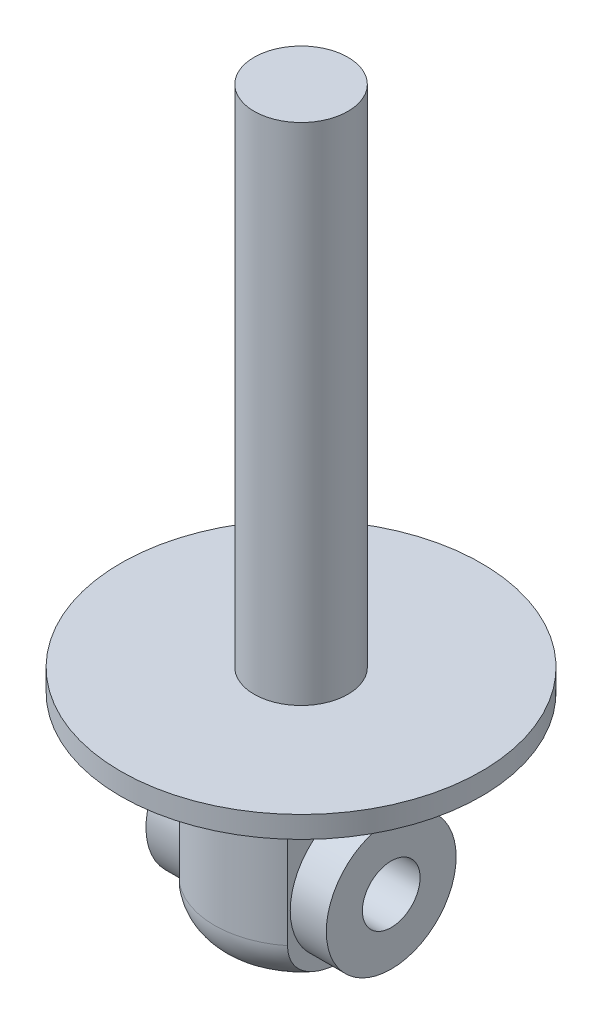
ISO-10303-21;
HEADER;
FILE_DESCRIPTION(('STEP AP214'),'2;1');
FILE_NAME('part.step','',(''),(''),'','','');
FILE_SCHEMA(('AUTOMOTIVE_DESIGN { 1 0 10303 214 1 1 1 1 }'));
ENDSEC;
DATA;
#1=APPLICATION_CONTEXT('core data for automotive mechanical design processes');
#2=APPLICATION_PROTOCOL_DEFINITION('international standard','automotive_design',2000,#1);
#3=PRODUCT_CONTEXT('',#1,'mechanical');
#4=PRODUCT('Part','Part','',(#3));
#5=PRODUCT_RELATED_PRODUCT_CATEGORY('part','',(#4));
#6=PRODUCT_DEFINITION_FORMATION('','',#4);
#7=PRODUCT_DEFINITION_CONTEXT('part definition',#1,'design');
#8=PRODUCT_DEFINITION('design','',#6,#7);
#9=PRODUCT_DEFINITION_SHAPE('','',#8);
#10=(LENGTH_UNIT() NAMED_UNIT(*) SI_UNIT(.MILLI.,.METRE.));
#11=(NAMED_UNIT(*) PLANE_ANGLE_UNIT() SI_UNIT($,.RADIAN.));
#12=(NAMED_UNIT(*) SI_UNIT($,.STERADIAN.) SOLID_ANGLE_UNIT());
#13=UNCERTAINTY_MEASURE_WITH_UNIT(LENGTH_MEASURE(1.E-05),#10,'distance_accuracy_value','');
#14=(GEOMETRIC_REPRESENTATION_CONTEXT(3) GLOBAL_UNCERTAINTY_ASSIGNED_CONTEXT((#13)) GLOBAL_UNIT_ASSIGNED_CONTEXT((#10,
#11,#12)) REPRESENTATION_CONTEXT('',''));
#15=CARTESIAN_POINT('',(0.,0.,0.));
#16=DIRECTION('',(0.,0.,1.));
#17=DIRECTION('',(1.,0.,0.));
#18=AXIS2_PLACEMENT_3D('',#15,#16,#17);
#19=CARTESIAN_POINT('',(7.5,-28.,-25.));
#20=DIRECTION('',(-1.,0.,0.));
#21=DIRECTION('',(0.,0.,1.));
#22=AXIS2_PLACEMENT_3D('',#19,#20,#21);
#23=PLANE('',#22);
#24=CARTESIAN_POINT('',(7.5,-27.8094750193111,0.));
#25=CARTESIAN_POINT('',(7.5,-27.8094752958151,-0.18452162824242));
#26=CARTESIAN_POINT('',(7.5,-27.8077270322999,-0.369043480287192));
#27=CARTESIAN_POINT('',(7.5,-27.8006130628877,-0.737999394292285));
#28=CARTESIAN_POINT('',(7.5,-27.7952477367066,-0.922433463434385));
#29=CARTESIAN_POINT('',(7.5,-27.780538513706,-1.29122559425462));
#30=CARTESIAN_POINT('',(7.5,-27.7711929215574,-1.47558358999919));
#31=CARTESIAN_POINT('',(7.5,-27.7479507640883,-1.84401846668315));
#32=CARTESIAN_POINT('',(7.5,-27.734054140347,-2.02809534398339));
#33=CARTESIAN_POINT('',(7.5,-27.701027325669,-2.39498843631837));
#34=CARTESIAN_POINT('',(7.5,-27.6819201299087,-2.57780665418326));
#35=CARTESIAN_POINT('',(7.5,-27.6375682217561,-2.94269408038084));
#36=CARTESIAN_POINT('',(7.5,-27.6123230495969,-3.12476323156505));
#37=CARTESIAN_POINT('',(7.5,-27.5259360262262,-3.6691632505479));
#38=CARTESIAN_POINT('',(7.5,-27.4541196223952,-4.02997739530099));
#39=CARTESIAN_POINT('',(7.5,-27.315114172541,-4.57935988961709));
#40=CARTESIAN_POINT('',(7.5,-27.2608348848703,-4.77122256452969));
#41=CARTESIAN_POINT('',(7.5,-27.1402411036094,-5.15109529504943));
#42=CARTESIAN_POINT('',(7.5,-27.0739312594077,-5.33910680786539));
#43=CARTESIAN_POINT('',(7.5,-26.9281486989919,-5.70992505463463));
#44=CARTESIAN_POINT('',(7.5,-26.8486797977089,-5.8927332791208));
#45=CARTESIAN_POINT('',(7.5,-26.6756224712841,-6.25155879665883));
#46=CARTESIAN_POINT('',(7.5,-26.5820364486501,-6.42757723883459));
#47=CARTESIAN_POINT('',(7.5,-26.3958384208508,-6.74413785402998));
#48=CARTESIAN_POINT('',(7.5,-26.3053527427416,-6.8859302136676));
#49=CARTESIAN_POINT('',(7.5,-26.1136422044668,-7.16205254122039));
#50=CARTESIAN_POINT('',(7.5,-26.0124194056704,-7.29638393401336));
#51=CARTESIAN_POINT('',(7.5,-25.7991822855038,-7.55627452274061));
#52=CARTESIAN_POINT('',(7.5,-25.6871652583255,-7.6818315054992));
#53=CARTESIAN_POINT('',(7.5,-25.4525813942248,-7.92270374400352));
#54=CARTESIAN_POINT('',(7.5,-25.3300144777409,-8.03801892249803));
#55=CARTESIAN_POINT('',(7.5,-25.0736714823962,-8.25792234562975));
#56=CARTESIAN_POINT('',(7.5,-24.9398051473305,-8.36240569865935));
#57=CARTESIAN_POINT('',(7.5,-24.662616920615,-8.55796576900282));
#58=CARTESIAN_POINT('',(7.5,-24.5192963548439,-8.64904436046083));
#59=CARTESIAN_POINT('',(7.5,-24.2243409104845,-8.81636481076627));
#60=CARTESIAN_POINT('',(7.5,-24.0727112205184,-8.89261579636783));
#61=CARTESIAN_POINT('',(7.5,-23.7624095052739,-9.02909243430965));
#62=CARTESIAN_POINT('',(7.5,-23.6037388369551,-9.08932115899453));
#63=CARTESIAN_POINT('',(7.5,-23.3052245459151,-9.1849514334904));
#64=CARTESIAN_POINT('',(7.5,-23.1661361294911,-9.22272405795733));
#65=CARTESIAN_POINT('',(7.5,-22.8851087613884,-9.28547940350163));
#66=CARTESIAN_POINT('',(7.5,-22.7431701638949,-9.31046370365637));
#67=CARTESIAN_POINT('',(7.5,-22.4576599589478,-9.34730641699015));
#68=CARTESIAN_POINT('',(7.5,-22.3140890586128,-9.35917031033292));
#69=CARTESIAN_POINT('',(7.5,-22.0264648581988,-9.36963164548865));
#70=CARTESIAN_POINT('',(7.5,-21.8824115750842,-9.36822954903947));
#71=CARTESIAN_POINT('',(7.5,-21.6061914815275,-9.35280339576898));
#72=CARTESIAN_POINT('',(7.5,-21.4739684759153,-9.33976569953801));
#73=CARTESIAN_POINT('',(7.5,-21.2110534946456,-9.3025636387872));
#74=CARTESIAN_POINT('',(7.5,-21.0803620180608,-9.27839574533066));
#75=CARTESIAN_POINT('',(7.5,-20.8215410609612,-9.21922065645586));
#76=CARTESIAN_POINT('',(7.5,-20.6934101253726,-9.1842198149556));
#77=CARTESIAN_POINT('',(7.5,-20.4404340442512,-9.1037455253616));
#78=CARTESIAN_POINT('',(7.5,-20.3155901493276,-9.05826815366643));
#79=CARTESIAN_POINT('',(7.5,-20.0692031015505,-8.95699564520569));
#80=CARTESIAN_POINT('',(7.5,-19.9476868658852,-8.90113499399755));
#81=CARTESIAN_POINT('',(7.5,-19.7094920695403,-8.77987692751896));
#82=CARTESIAN_POINT('',(7.5,-19.5928152563103,-8.71447610526943));
#83=CARTESIAN_POINT('',(7.5,-19.2509911073174,-8.50489875856371));
#84=CARTESIAN_POINT('',(7.5,-19.0339195251877,-8.34729299116934));
#85=CARTESIAN_POINT('',(7.5,-18.609337427954,-7.98870608163153));
#86=CARTESIAN_POINT('',(7.5,-18.4039002281567,-7.78529755950601));
#87=CARTESIAN_POINT('',(7.5,-18.0246758733926,-7.35109040646743));
#88=CARTESIAN_POINT('',(7.5,-17.8508837047537,-7.12029612399674));
#89=CARTESIAN_POINT('',(7.5,-17.5744409595824,-6.69864287979115));
#90=CARTESIAN_POINT('',(7.5,-17.4648689537028,-6.51223410047273));
#91=CARTESIAN_POINT('',(7.5,-17.2626904112623,-6.13034538679086));
#92=CARTESIAN_POINT('',(7.5,-17.1700919878543,-5.93486117014358));
#93=CARTESIAN_POINT('',(7.5,-17.0006313082269,-5.53658641063457));
#94=CARTESIAN_POINT('',(7.5,-16.9238147555949,-5.3337765932138));
#95=CARTESIAN_POINT('',(7.5,-16.784875362625,-4.9233142846081));
#96=CARTESIAN_POINT('',(7.5,-16.7227484430634,-4.71566315546474));
#97=CARTESIAN_POINT('',(7.5,-16.5386673542946,-4.02250667384635));
#98=CARTESIAN_POINT('',(7.5,-16.4449803111871,-3.52942656369882));
#99=CARTESIAN_POINT('',(7.5,-16.3412352530644,-2.78498720051467));
#100=CARTESIAN_POINT('',(7.5,-16.3127705467372,-2.5356855777005));
#101=CARTESIAN_POINT('',(7.5,-16.2658269581612,-2.03612434937439));
#102=CARTESIAN_POINT('',(7.5,-16.2473468655649,-1.78586486368142));
#103=CARTESIAN_POINT('',(7.5,-16.2184283009414,-1.28363112408653));
#104=CARTESIAN_POINT('',(7.5,-16.208031590786,-1.03165466176092));
#105=CARTESIAN_POINT('',(7.5,-16.1941849220444,-0.527501194688685));
#106=CARTESIAN_POINT('',(7.5,-16.1907352988047,-0.275324180848917));
#107=CARTESIAN_POINT('',(7.5,-16.1903333462322,0.228731345602969));
#108=CARTESIAN_POINT('',(7.5,-16.193373232494,0.480609853630167));
#109=CARTESIAN_POINT('',(7.5,-16.2063332691715,0.984173581494259));
#110=CARTESIAN_POINT('',(7.5,-16.2162528039696,1.23585881660873));
#111=CARTESIAN_POINT('',(7.5,-16.2454935008677,1.76278825668933));
#112=CARTESIAN_POINT('',(7.5,-16.2656211327378,2.03798990109171));
#113=CARTESIAN_POINT('',(7.5,-16.3180418431017,2.58731345976838));
#114=CARTESIAN_POINT('',(7.5,-16.3503365349836,2.86143522597443));
#115=CARTESIAN_POINT('',(7.5,-16.4300545548583,3.40623279358436));
#116=CARTESIAN_POINT('',(7.5,-16.4774071358833,3.67691867401873));
#117=CARTESIAN_POINT('',(7.5,-16.5907053400646,4.21439476079951));
#118=CARTESIAN_POINT('',(7.5,-16.6566449229111,4.4811862031647));
#119=CARTESIAN_POINT('',(7.5,-16.7911834026755,4.94217748017442));
#120=CARTESIAN_POINT('',(7.5,-16.8549558474619,5.13778160857807));
#121=CARTESIAN_POINT('',(7.5,-16.9961265709521,5.5239942274174));
#122=CARTESIAN_POINT('',(7.5,-17.0735207892669,5.71460418712136));
#123=CARTESIAN_POINT('',(7.5,-17.2430793617625,6.08921987221889));
#124=CARTESIAN_POINT('',(7.5,-17.3352463319138,6.27322442084438));
#125=CARTESIAN_POINT('',(7.5,-17.5351759469553,6.63256976145457));
#126=CARTESIAN_POINT('',(7.5,-17.6429345063483,6.80791280693597));
#127=CARTESIAN_POINT('',(7.5,-17.8487615005736,7.10989658300674));
#128=CARTESIAN_POINT('',(7.5,-17.9436617626469,7.23870103997639));
#129=CARTESIAN_POINT('',(7.5,-18.143229826346,7.48856622066219));
#130=CARTESIAN_POINT('',(7.5,-18.2478987883735,7.60962602152205));
#131=CARTESIAN_POINT('',(7.5,-18.4668045949393,7.84271387792474));
#132=CARTESIAN_POINT('',(7.5,-18.5810384459287,7.95474473789612));
#133=CARTESIAN_POINT('',(7.5,-18.8187268203134,8.16854933672494));
#134=CARTESIAN_POINT('',(7.5,-18.9421800591116,8.27032449994957));
#135=CARTESIAN_POINT('',(7.5,-19.1987356397018,8.46313596223061));
#136=CARTESIAN_POINT('',(7.5,-19.3319055781875,8.55408255407202));
#137=CARTESIAN_POINT('',(7.5,-19.6061418402457,8.72304401015934));
#138=CARTESIAN_POINT('',(7.5,-19.747204378254,8.80106500403696));
#139=CARTESIAN_POINT('',(7.5,-20.0362068877473,8.94309470867639));
#140=CARTESIAN_POINT('',(7.5,-20.1841460034049,9.00710515749598));
#141=CARTESIAN_POINT('',(7.5,-20.4856380297523,9.12014361193693));
#142=CARTESIAN_POINT('',(7.5,-20.6391901444676,9.16917373274798));
#143=CARTESIAN_POINT('',(7.5,-20.9313639562727,9.24643392787081));
#144=CARTESIAN_POINT('',(7.5,-21.0695088202567,9.27647685632879));
#145=CARTESIAN_POINT('',(7.5,-21.3479315795213,9.32406143536891));
#146=CARTESIAN_POINT('',(7.5,-21.4882092809526,9.34160421520928));
#147=CARTESIAN_POINT('',(7.5,-21.769719609589,9.36396002322678));
#148=CARTESIAN_POINT('',(7.5,-21.9109518422674,9.36877802253041));
#149=CARTESIAN_POINT('',(7.5,-22.1932734390957,9.36563613906261));
#150=CARTESIAN_POINT('',(7.5,-22.3343628067459,9.35767657732182));
#151=CARTESIAN_POINT('',(7.5,-22.6064011749062,9.32998563551062));
#152=CARTESIAN_POINT('',(7.5,-22.7374295539783,9.31102660205278));
#153=CARTESIAN_POINT('',(7.5,-22.9974780227225,9.26218788836622));
#154=CARTESIAN_POINT('',(7.5,-23.1264974548056,9.23230470755187));
#155=CARTESIAN_POINT('',(7.5,-23.3815508516767,9.16196479385525));
#156=CARTESIAN_POINT('',(7.5,-23.5075862018083,9.12151307666088));
#157=CARTESIAN_POINT('',(7.5,-23.7559772755244,9.03044888037393));
#158=CARTESIAN_POINT('',(7.5,-23.8783315975104,8.97983258590814));
#159=CARTESIAN_POINT('',(7.5,-24.1205569584555,8.8680617574251));
#160=CARTESIAN_POINT('',(7.5,-24.2403549182387,8.80674877020291));
#161=CARTESIAN_POINT('',(7.5,-24.4747211723639,8.67480187441993));
#162=CARTESIAN_POINT('',(7.5,-24.5892875713423,8.60416462323317));
#163=CARTESIAN_POINT('',(7.5,-24.9242270275788,8.37928997825773));
#164=CARTESIAN_POINT('',(7.5,-25.13600210755,8.21201407264852));
#165=CARTESIAN_POINT('',(7.5,-25.5504485361803,7.832942739178));
#166=CARTESIAN_POINT('',(7.5,-25.7507010772538,7.618532285847));
#167=CARTESIAN_POINT('',(7.5,-26.1185076671662,7.16337882817298));
#168=CARTESIAN_POINT('',(7.5,-26.2860513710234,6.9226275303298));
#169=CARTESIAN_POINT('',(7.5,-26.5545024709803,6.4788664395953));
#170=CARTESIAN_POINT('',(7.5,-26.6619013252763,6.279707295078));
#171=CARTESIAN_POINT('',(7.5,-26.858559219587,5.87254463104013));
#172=CARTESIAN_POINT('',(7.5,-26.9478095430477,5.66453691936401));
#173=CARTESIAN_POINT('',(7.5,-27.1096214973705,5.24180758530232));
#174=CARTESIAN_POINT('',(7.5,-27.1821555960046,5.02707553901331));
#175=CARTESIAN_POINT('',(7.5,-27.3121001369762,4.59305326757355));
#176=CARTESIAN_POINT('',(7.5,-27.3695048137837,4.37376133898656));
#177=CARTESIAN_POINT('',(7.5,-27.4981886749365,3.81417726059937));
#178=CARTESIAN_POINT('',(7.5,-27.5604951716191,3.47183296905169));
#179=CARTESIAN_POINT('',(7.5,-27.6609019684328,2.78359200614869));
#180=CARTESIAN_POINT('',(7.5,-27.6989863972919,2.43769315620305));
#181=CARTESIAN_POINT('',(7.5,-27.7425563308733,1.91723181279188));
#182=CARTESIAN_POINT('',(7.5,-27.7548291128016,1.74318957751326));
#183=CARTESIAN_POINT('',(7.5,-27.7753986995787,1.39487161182967));
#184=CARTESIAN_POINT('',(7.5,-27.7836956019396,1.22059588725638));
#185=CARTESIAN_POINT('',(7.5,-27.796777523185,0.871965392986039));
#186=CARTESIAN_POINT('',(7.5,-27.8015635129394,0.69761065849217));
#187=CARTESIAN_POINT('',(7.5,-27.8079121855994,0.348837350643893));
#188=CARTESIAN_POINT('',(7.5,-27.8094747579462,0.174418775305038));
#189=CARTESIAN_POINT('',(7.5,-27.8094750193111,0.));
#190=B_SPLINE_CURVE_WITH_KNOTS('',3,(#24,#25,#26,#27,#28,#29,#30,#31,#32,#33,#34,#35,#36,#37,
#38,#39,#40,#41,#42,#43,#44,#45,#46,#47,#48,#49,#50,#51,#52,#53,#54,#55,#56,#57,#58,#59,#60,#61,
#62,#63,#64,#65,#66,#67,#68,#69,#70,#71,#72,#73,#74,#75,#76,#77,#78,#79,#80,#81,#82,#83,#84,#85,
#86,#87,#88,#89,#90,#91,#92,#93,#94,#95,#96,#97,#98,#99,#100,#101,#102,#103,#104,#105,#106,#107,
#108,#109,#110,#111,#112,#113,#114,#115,#116,#117,#118,#119,#120,#121,#122,#123,#124,#125,#126,
#127,#128,#129,#130,#131,#132,#133,#134,#135,#136,#137,#138,#139,#140,#141,#142,#143,#144,#145,
#146,#147,#148,#149,#150,#151,#152,#153,#154,#155,#156,#157,#158,#159,#160,#161,#162,#163,#164,
#165,#166,#167,#168,#169,#170,#171,#172,#173,#174,#175,#176,#177,#178,#179,#180,#181,#182,#183,
#184,#185,#186,#187,#188,#189),.UNSPECIFIED.,.T.,.F.,(4,2,2,2,2,2,2,2,2,2,2,2,2,2,2,2,2,2,2,2,2,
2,2,2,2,2,2,2,2,2,2,2,2,2,2,2,2,2,2,2,2,2,2,2,2,2,2,2,2,2,2,2,2,2,2,2,2,2,2,2,2,2,2,2,2,2,2,2,2,
2,2,2,2,2,2,2,2,2,2,2,2,2,4),(0.,0.553556541747909,1.10705498067111,1.66078940935171,
2.21453094651203,2.7658672034967,3.31724477121585,4.41912680182767,5.01698525599297,
5.61461314908642,6.21206808675634,6.80942146164093,7.31357153503217,7.81762499361292,
8.32180513447662,8.82598907791493,9.33467160980088,9.84328295415676,10.3515802378956,
10.8597799828438,11.291588037567,11.7233427606026,12.1549170790764,12.5864763761707,
12.9845986570771,13.3828472534997,13.7808627038906,14.1790274594522,14.579795450788,
14.9807069160888,15.7821103743006,16.6461503316802,17.5100532757815,18.1578732554314,
18.8060020817716,19.4559821948789,20.1057815998326,21.6069748462105,22.3596793389022,
23.1122925673176,23.8687687149109,24.6252813779039,25.3808870860739,26.1364251884592,
26.9640249034878,27.7917343993232,28.6156111127982,29.4392203950451,30.0559954213971,
30.6725869093732,31.2892877047367,31.9058271963482,32.3853559200308,32.8649416785199,
33.3443778968313,33.823747436381,34.3068464150843,34.7897156366603,35.2725249226045,
35.7552660053908,36.1788379642464,36.6023716529342,37.0257398573389,37.4490974249689,
37.8458122806135,38.2426543730445,38.6393084704929,39.0361117351622,39.4393886143668,
39.8428104576491,40.6491243408277,41.5260051520067,42.403162850804,43.0810551134699,
43.7592721958252,44.4385984678267,45.1181832448308,46.1608437011148,47.2041866484774,
47.7275747628343,48.2509500399341,48.7741805338585,49.2974289735857),.UNSPECIFIED.);
#191=CARTESIAN_POINT('',(7.5,-22.,9.3674969975976));
#192=VERTEX_POINT('',#191);
#193=CARTESIAN_POINT('',(7.5,-21.9999999999999,-9.36749699759766));
#194=VERTEX_POINT('',#193);
#195=EDGE_CURVE('E151',#192,#194,#190,.T.);
#196=ORIENTED_EDGE('',*,*,#195,.T.);
#197=DIRECTION('',(0.,1.,0.));
#198=VECTOR('',#197,1.);
#199=CARTESIAN_POINT('',(7.5,-28.,-9.3674969975976));
#200=LINE('',#199,#198);
#201=CARTESIAN_POINT('',(7.5,-8.,-9.3674969975976));
#202=VERTEX_POINT('',#201);
#203=EDGE_CURVE('E116',#202,#194,#200,.F.);
#204=ORIENTED_EDGE('',*,*,#203,.F.);
#205=DIRECTION('',(0.,0.,1.));
#206=VECTOR('',#205,1.);
#207=CARTESIAN_POINT('',(7.5,-8.,-25.));
#208=LINE('',#207,#206);
#209=CARTESIAN_POINT('',(7.5,-8.,9.3674969975976));
#210=VERTEX_POINT('',#209);
#211=EDGE_CURVE('E110',#202,#210,#208,.T.);
#212=ORIENTED_EDGE('',*,*,#211,.T.);
#213=DIRECTION('',(0.,1.,0.));
#214=VECTOR('',#213,1.);
#215=CARTESIAN_POINT('',(7.5,-28.,9.3674969975976));
#216=LINE('',#215,#214);
#217=EDGE_CURVE('E122',#192,#210,#216,.T.);
#218=ORIENTED_EDGE('',*,*,#217,.F.);
#219=EDGE_LOOP('',(#196,#204,#212,#218));
#220=FACE_BOUND('',#219,.T.);
#221=CARTESIAN_POINT('',(7.5,-18.,0.));
#222=DIRECTION('',(-1.,0.,0.));
#223=DIRECTION('',(0.,0.,1.));
#224=AXIS2_PLACEMENT_3D('',#221,#222,#223);
#225=CIRCLE('',#224,9.);
#226=CARTESIAN_POINT('',(7.5,-18.,8.99999999999999));
#227=VERTEX_POINT('',#226);
#228=EDGE_CURVE('E11',#227,#227,#225,.F.);
#229=ORIENTED_EDGE('',*,*,#228,.F.);
#230=EDGE_LOOP('',(#229));
#231=FACE_BOUND('',#230,.T.);
#232=ADVANCED_FACE('F45',(#220,#231),#23,.F.);
#233=CARTESIAN_POINT('',(-7.49999999999999,-28.,-25.));
#234=DIRECTION('',(1.,0.,0.));
#235=DIRECTION('',(0.,1.,0.));
#236=AXIS2_PLACEMENT_3D('',#233,#234,#235);
#237=PLANE('',#236);
#238=CARTESIAN_POINT('',(-7.49999999999999,-27.8094750193111,0.));
#239=CARTESIAN_POINT('',(-7.49999999999999,-27.8094752958151,0.184521628242419));
#240=CARTESIAN_POINT('',(-7.49999999999999,-27.8077270322999,0.369043480287191));
#241=CARTESIAN_POINT('',(-7.49999999999999,-27.8006130628877,0.737999394292284));
#242=CARTESIAN_POINT('',(-7.49999999999999,-27.7952477367066,0.922433463434384));
#243=CARTESIAN_POINT('',(-7.49999999999999,-27.780538513706,1.29122559425462));
#244=CARTESIAN_POINT('',(-7.49999999999999,-27.7711929215574,1.47558358999919));
#245=CARTESIAN_POINT('',(-7.49999999999999,-27.7479507640883,1.84401846668315));
#246=CARTESIAN_POINT('',(-7.49999999999999,-27.734054140347,2.02809534398339));
#247=CARTESIAN_POINT('',(-7.49999999999999,-27.701027325669,2.39498843631837));
#248=CARTESIAN_POINT('',(-7.49999999999999,-27.6819201299087,2.57780665418326));
#249=CARTESIAN_POINT('',(-7.49999999999999,-27.6375682217561,2.94269408038083));
#250=CARTESIAN_POINT('',(-7.49999999999999,-27.6123230495969,3.12476323156505));
#251=CARTESIAN_POINT('',(-7.49999999999999,-27.5259360262262,3.6691632505479));
#252=CARTESIAN_POINT('',(-7.49999999999999,-27.4541196223952,4.02997739530099));
#253=CARTESIAN_POINT('',(-7.49999999999999,-27.315114172541,4.57935988961709));
#254=CARTESIAN_POINT('',(-7.49999999999999,-27.2608348848703,4.77122256452969));
#255=CARTESIAN_POINT('',(-7.49999999999999,-27.1402411036094,5.15109529504943));
#256=CARTESIAN_POINT('',(-7.49999999999999,-27.0739312594077,5.33910680786539));
#257=CARTESIAN_POINT('',(-7.49999999999999,-26.928148698992,5.70992505463463));
#258=CARTESIAN_POINT('',(-7.49999999999999,-26.8486797977089,5.8927332791208));
#259=CARTESIAN_POINT('',(-7.49999999999999,-26.6756224712841,6.25155879665883));
#260=CARTESIAN_POINT('',(-7.49999999999999,-26.5820364486502,6.42757723883459));
#261=CARTESIAN_POINT('',(-7.49999999999999,-26.3958384208508,6.74413785402998));
#262=CARTESIAN_POINT('',(-7.49999999999999,-26.3053527427416,6.8859302136676));
#263=CARTESIAN_POINT('',(-7.49999999999999,-26.1136422044668,7.16205254122039));
#264=CARTESIAN_POINT('',(-7.49999999999999,-26.0124194056704,7.29638393401336));
#265=CARTESIAN_POINT('',(-7.49999999999999,-25.7991822855038,7.55627452274061));
#266=CARTESIAN_POINT('',(-7.49999999999999,-25.6871652583255,7.6818315054992));
#267=CARTESIAN_POINT('',(-7.49999999999999,-25.4525813942248,7.92270374400352));
#268=CARTESIAN_POINT('',(-7.49999999999999,-25.3300144777409,8.03801892249803));
#269=CARTESIAN_POINT('',(-7.49999999999999,-25.0736714823962,8.25792234562976));
#270=CARTESIAN_POINT('',(-7.49999999999999,-24.9398051473305,8.36240569865935));
#271=CARTESIAN_POINT('',(-7.49999999999999,-24.662616920615,8.55796576900282));
#272=CARTESIAN_POINT('',(-7.49999999999999,-24.5192963548439,8.64904436046083));
#273=CARTESIAN_POINT('',(-7.49999999999999,-24.2243409104845,8.81636481076627));
#274=CARTESIAN_POINT('',(-7.49999999999999,-24.0727112205184,8.89261579636784));
#275=CARTESIAN_POINT('',(-7.49999999999999,-23.7624095052739,9.02909243430965));
#276=CARTESIAN_POINT('',(-7.49999999999999,-23.6037388369551,9.08932115899454));
#277=CARTESIAN_POINT('',(-7.49999999999999,-23.3052245459151,9.1849514334904));
#278=CARTESIAN_POINT('',(-7.49999999999999,-23.1661361294911,9.22272405795734));
#279=CARTESIAN_POINT('',(-7.49999999999999,-22.8851087613884,9.28547940350164));
#280=CARTESIAN_POINT('',(-7.49999999999999,-22.7431701638949,9.31046370365637));
#281=CARTESIAN_POINT('',(-7.49999999999999,-22.4576599589478,9.34730641699016));
#282=CARTESIAN_POINT('',(-7.49999999999999,-22.3140890586128,9.35917031033292));
#283=CARTESIAN_POINT('',(-7.49999999999999,-22.0264648581988,9.36963164548866));
#284=CARTESIAN_POINT('',(-7.49999999999999,-21.8824115750842,9.36822954903948));
#285=CARTESIAN_POINT('',(-7.49999999999999,-21.6061914815275,9.35280339576899));
#286=CARTESIAN_POINT('',(-7.49999999999999,-21.4739684759153,9.33976569953801));
#287=CARTESIAN_POINT('',(-7.49999999999999,-21.2110534946456,9.30256363878721));
#288=CARTESIAN_POINT('',(-7.49999999999999,-21.0803620180608,9.27839574533066));
#289=CARTESIAN_POINT('',(-7.49999999999999,-20.8215410609612,9.21922065645586));
#290=CARTESIAN_POINT('',(-7.49999999999999,-20.6934101253726,9.18421981495561));
#291=CARTESIAN_POINT('',(-7.49999999999999,-20.4404340442512,9.10374552536161));
#292=CARTESIAN_POINT('',(-7.49999999999999,-20.3155901493276,9.05826815366643));
#293=CARTESIAN_POINT('',(-7.49999999999999,-20.0692031015505,8.95699564520569));
#294=CARTESIAN_POINT('',(-7.49999999999999,-19.9476868658852,8.90113499399756));
#295=CARTESIAN_POINT('',(-7.49999999999999,-19.7094920695403,8.77987692751897));
#296=CARTESIAN_POINT('',(-7.5,-19.5928152563103,8.71447610526943));
#297=CARTESIAN_POINT('',(-7.5,-19.2509911073174,8.50489875856372));
#298=CARTESIAN_POINT('',(-7.5,-19.0339195251877,8.34729299116934));
#299=CARTESIAN_POINT('',(-7.5,-18.609337427954,7.98870608163153));
#300=CARTESIAN_POINT('',(-7.5,-18.4039002281567,7.78529755950601));
#301=CARTESIAN_POINT('',(-7.5,-18.0246758733926,7.35109040646743));
#302=CARTESIAN_POINT('',(-7.5,-17.8508837047537,7.12029612399675));
#303=CARTESIAN_POINT('',(-7.5,-17.5744409595824,6.69864287979116));
#304=CARTESIAN_POINT('',(-7.5,-17.4648689537028,6.51223410047273));
#305=CARTESIAN_POINT('',(-7.5,-17.2626904112623,6.13034538679086));
#306=CARTESIAN_POINT('',(-7.5,-17.1700919878543,5.93486117014358));
#307=CARTESIAN_POINT('',(-7.5,-17.0006313082269,5.53658641063457));
#308=CARTESIAN_POINT('',(-7.5,-16.9238147555949,5.3337765932138));
#309=CARTESIAN_POINT('',(-7.5,-16.784875362625,4.9233142846081));
#310=CARTESIAN_POINT('',(-7.5,-16.7227484430634,4.71566315546474));
#311=CARTESIAN_POINT('',(-7.5,-16.5386673542946,4.02250667384635));
#312=CARTESIAN_POINT('',(-7.49999999999999,-16.4449803111871,3.52942656369881));
#313=CARTESIAN_POINT('',(-7.5,-16.3412352530644,2.78498720051466));
#314=CARTESIAN_POINT('',(-7.5,-16.3127705467372,2.53568557770049));
#315=CARTESIAN_POINT('',(-7.5,-16.2658269581612,2.03612434937438));
#316=CARTESIAN_POINT('',(-7.5,-16.2473468655648,1.78586486368142));
#317=CARTESIAN_POINT('',(-7.5,-16.2184283009414,1.28363112408652));
#318=CARTESIAN_POINT('',(-7.5,-16.208031590786,1.03165466176091));
#319=CARTESIAN_POINT('',(-7.5,-16.1941849220443,0.527501194688679));
#320=CARTESIAN_POINT('',(-7.5,-16.1907352988047,0.275324180848911));
#321=CARTESIAN_POINT('',(-7.5,-16.1903333462322,-0.228731345602977));
#322=CARTESIAN_POINT('',(-7.5,-16.193373232494,-0.480609853630177));
#323=CARTESIAN_POINT('',(-7.5,-16.2063332691715,-0.984173581494269));
#324=CARTESIAN_POINT('',(-7.5,-16.2162528039696,-1.23585881660874));
#325=CARTESIAN_POINT('',(-7.5,-16.2454935008677,-1.76278825668934));
#326=CARTESIAN_POINT('',(-7.5,-16.2656211327378,-2.03798990109171));
#327=CARTESIAN_POINT('',(-7.5,-16.3180418431017,-2.58731345976839));
#328=CARTESIAN_POINT('',(-7.5,-16.3503365349836,-2.86143522597444));
#329=CARTESIAN_POINT('',(-7.5,-16.4300545548583,-3.40623279358437));
#330=CARTESIAN_POINT('',(-7.5,-16.4774071358833,-3.67691867401873));
#331=CARTESIAN_POINT('',(-7.5,-16.5907053400646,-4.21439476079951));
#332=CARTESIAN_POINT('',(-7.5,-16.6566449229111,-4.4811862031647));
#333=CARTESIAN_POINT('',(-7.5,-16.7911834026755,-4.94217748017443));
#334=CARTESIAN_POINT('',(-7.5,-16.8549558474619,-5.13778160857807));
#335=CARTESIAN_POINT('',(-7.5,-16.9961265709521,-5.5239942274174));
#336=CARTESIAN_POINT('',(-7.5,-17.0735207892669,-5.71460418712136));
#337=CARTESIAN_POINT('',(-7.5,-17.2430793617625,-6.08921987221889));
#338=CARTESIAN_POINT('',(-7.5,-17.3352463319138,-6.27322442084438));
#339=CARTESIAN_POINT('',(-7.5,-17.5351759469553,-6.63256976145457));
#340=CARTESIAN_POINT('',(-7.5,-17.6429345063483,-6.80791280693598));
#341=CARTESIAN_POINT('',(-7.5,-17.8487615005736,-7.10989658300674));
#342=CARTESIAN_POINT('',(-7.5,-17.9436617626469,-7.23870103997639));
#343=CARTESIAN_POINT('',(-7.5,-18.143229826346,-7.48856622066219));
#344=CARTESIAN_POINT('',(-7.5,-18.2478987883735,-7.60962602152205));
#345=CARTESIAN_POINT('',(-7.5,-18.4668045949393,-7.84271387792475));
#346=CARTESIAN_POINT('',(-7.5,-18.5810384459287,-7.95474473789612));
#347=CARTESIAN_POINT('',(-7.5,-18.8187268203134,-8.16854933672495));
#348=CARTESIAN_POINT('',(-7.5,-18.9421800591116,-8.27032449994957));
#349=CARTESIAN_POINT('',(-7.5,-19.1987356397018,-8.46313596223061));
#350=CARTESIAN_POINT('',(-7.5,-19.3319055781875,-8.55408255407203));
#351=CARTESIAN_POINT('',(-7.5,-19.6061418402457,-8.72304401015934));
#352=CARTESIAN_POINT('',(-7.49999999999999,-19.747204378254,-8.80106500403696));
#353=CARTESIAN_POINT('',(-7.49999999999999,-20.0362068877473,-8.94309470867639));
#354=CARTESIAN_POINT('',(-7.49999999999999,-20.1841460034049,-9.00710515749598));
#355=CARTESIAN_POINT('',(-7.49999999999999,-20.4856380297523,-9.12014361193693));
#356=CARTESIAN_POINT('',(-7.49999999999999,-20.6391901444676,-9.16917373274798));
#357=CARTESIAN_POINT('',(-7.49999999999999,-20.9313639562727,-9.24643392787081));
#358=CARTESIAN_POINT('',(-7.49999999999999,-21.0695088202567,-9.2764768563288));
#359=CARTESIAN_POINT('',(-7.49999999999999,-21.3479315795213,-9.32406143536892));
#360=CARTESIAN_POINT('',(-7.49999999999999,-21.4882092809527,-9.34160421520928));
#361=CARTESIAN_POINT('',(-7.49999999999999,-21.769719609589,-9.36396002322679));
#362=CARTESIAN_POINT('',(-7.49999999999999,-21.9109518422674,-9.36877802253041));
#363=CARTESIAN_POINT('',(-7.49999999999999,-22.1932734390957,-9.36563613906261));
#364=CARTESIAN_POINT('',(-7.49999999999999,-22.3343628067459,-9.35767657732182));
#365=CARTESIAN_POINT('',(-7.49999999999999,-22.6064011749062,-9.32998563551063));
#366=CARTESIAN_POINT('',(-7.49999999999999,-22.7374295539783,-9.31102660205279));
#367=CARTESIAN_POINT('',(-7.49999999999999,-22.9974780227225,-9.26218788836622));
#368=CARTESIAN_POINT('',(-7.49999999999999,-23.1264974548056,-9.23230470755187));
#369=CARTESIAN_POINT('',(-7.49999999999999,-23.3815508516768,-9.16196479385525));
#370=CARTESIAN_POINT('',(-7.49999999999999,-23.5075862018083,-9.12151307666089));
#371=CARTESIAN_POINT('',(-7.49999999999999,-23.7559772755244,-9.03044888037394));
#372=CARTESIAN_POINT('',(-7.49999999999999,-23.8783315975104,-8.97983258590814));
#373=CARTESIAN_POINT('',(-7.49999999999999,-24.1205569584555,-8.8680617574251));
#374=CARTESIAN_POINT('',(-7.49999999999999,-24.2403549182387,-8.80674877020291));
#375=CARTESIAN_POINT('',(-7.49999999999999,-24.4747211723639,-8.67480187441993));
#376=CARTESIAN_POINT('',(-7.49999999999999,-24.5892875713423,-8.60416462323317));
#377=CARTESIAN_POINT('',(-7.49999999999999,-24.9242270275788,-8.37928997825774));
#378=CARTESIAN_POINT('',(-7.49999999999999,-25.13600210755,-8.21201407264852));
#379=CARTESIAN_POINT('',(-7.49999999999999,-25.5504485361803,-7.832942739178));
#380=CARTESIAN_POINT('',(-7.49999999999999,-25.7507010772538,-7.618532285847));
#381=CARTESIAN_POINT('',(-7.49999999999999,-26.1185076671662,-7.16337882817299));
#382=CARTESIAN_POINT('',(-7.49999999999999,-26.2860513710234,-6.9226275303298));
#383=CARTESIAN_POINT('',(-7.49999999999999,-26.5545024709803,-6.4788664395953));
#384=CARTESIAN_POINT('',(-7.49999999999999,-26.6619013252763,-6.279707295078));
#385=CARTESIAN_POINT('',(-7.49999999999999,-26.858559219587,-5.87254463104013));
#386=CARTESIAN_POINT('',(-7.49999999999999,-26.9478095430477,-5.66453691936402));
#387=CARTESIAN_POINT('',(-7.49999999999999,-27.1096214973705,-5.24180758530233));
#388=CARTESIAN_POINT('',(-7.49999999999999,-27.1821555960046,-5.02707553901332));
#389=CARTESIAN_POINT('',(-7.49999999999999,-27.3121001369762,-4.59305326757357));
#390=CARTESIAN_POINT('',(-7.49999999999999,-27.3695048137837,-4.37376133898657));
#391=CARTESIAN_POINT('',(-7.49999999999999,-27.4981886749365,-3.81417726059937));
#392=CARTESIAN_POINT('',(-7.49999999999999,-27.5604951716191,-3.4718329690517));
#393=CARTESIAN_POINT('',(-7.49999999999999,-27.6609019684328,-2.78359200614869));
#394=CARTESIAN_POINT('',(-7.49999999999999,-27.6989863972919,-2.43769315620305));
#395=CARTESIAN_POINT('',(-7.49999999999999,-27.7425563308733,-1.91723181279188));
#396=CARTESIAN_POINT('',(-7.49999999999999,-27.7548291128016,-1.74318957751326));
#397=CARTESIAN_POINT('',(-7.49999999999999,-27.7753986995787,-1.39487161182967));
#398=CARTESIAN_POINT('',(-7.49999999999999,-27.7836956019396,-1.22059588725638));
#399=CARTESIAN_POINT('',(-7.49999999999999,-27.796777523185,-0.87196539298604));
#400=CARTESIAN_POINT('',(-7.49999999999999,-27.8015635129394,-0.697610658492171));
#401=CARTESIAN_POINT('',(-7.49999999999999,-27.8079121855994,-0.348837350643893));
#402=CARTESIAN_POINT('',(-7.49999999999999,-27.8094747579462,-0.174418775305038));
#403=CARTESIAN_POINT('',(-7.49999999999999,-27.8094750193111,0.));
#404=B_SPLINE_CURVE_WITH_KNOTS('',3,(#238,#239,#240,#241,#242,#243,#244,#245,#246,#247,#248,
#249,#250,#251,#252,#253,#254,#255,#256,#257,#258,#259,#260,#261,#262,#263,#264,#265,#266,#267,
#268,#269,#270,#271,#272,#273,#274,#275,#276,#277,#278,#279,#280,#281,#282,#283,#284,#285,#286,
#287,#288,#289,#290,#291,#292,#293,#294,#295,#296,#297,#298,#299,#300,#301,#302,#303,#304,#305,
#306,#307,#308,#309,#310,#311,#312,#313,#314,#315,#316,#317,#318,#319,#320,#321,#322,#323,#324,
#325,#326,#327,#328,#329,#330,#331,#332,#333,#334,#335,#336,#337,#338,#339,#340,#341,#342,#343,
#344,#345,#346,#347,#348,#349,#350,#351,#352,#353,#354,#355,#356,#357,#358,#359,#360,#361,#362,
#363,#364,#365,#366,#367,#368,#369,#370,#371,#372,#373,#374,#375,#376,#377,#378,#379,#380,#381,
#382,#383,#384,#385,#386,#387,#388,#389,#390,#391,#392,#393,#394,#395,#396,#397,#398,#399,#400,
#401,#402,#403),.UNSPECIFIED.,.T.,.F.,(4,2,2,2,2,2,2,2,2,2,2,2,2,2,2,2,2,2,2,2,2,2,2,2,2,2,2,2,
2,2,2,2,2,2,2,2,2,2,2,2,2,2,2,2,2,2,2,2,2,2,2,2,2,2,2,2,2,2,2,2,2,2,2,2,2,2,2,2,2,2,2,2,2,2,2,2,
2,2,2,2,2,2,4),(0.,0.553556541747908,1.10705498067111,1.6607894093517,2.21453094651203,
2.7658672034967,3.31724477121585,4.41912680182767,5.01698525599297,5.61461314908642,
6.21206808675634,6.80942146164093,7.31357153503217,7.81762499361292,8.32180513447662,
8.82598907791493,9.33467160980088,9.84328295415677,10.3515802378956,10.8597799828438,
11.291588037567,11.7233427606026,12.1549170790764,12.5864763761707,12.9845986570771,
13.3828472534997,13.7808627038906,14.1790274594522,14.579795450788,14.9807069160888,
15.7821103743006,16.6461503316802,17.5100532757815,18.1578732554314,18.8060020817716,
19.4559821948789,20.1057815998326,21.6069748462106,22.3596793389022,23.1122925673176,
23.8687687149109,24.6252813779039,25.3808870860739,26.1364251884592,26.9640249034878,
27.7917343993232,28.6156111127982,29.4392203950451,30.0559954213972,30.6725869093733,
31.2892877047367,31.9058271963483,32.3853559200308,32.86494167852,33.3443778968313,
33.823747436381,34.3068464150844,34.7897156366604,35.2725249226045,35.7552660053908,
36.1788379642465,36.6023716529343,37.0257398573389,37.4490974249689,37.8458122806135,
38.2426543730445,38.639308470493,39.0361117351623,39.4393886143668,39.8428104576492,
40.6491243408277,41.5260051520067,42.403162850804,43.08105511347,43.7592721958252,
44.4385984678268,45.1181832448309,46.1608437011148,47.2041866484774,47.7275747628344,
48.2509500399341,48.7741805338586,49.2974289735857),.UNSPECIFIED.);
#405=CARTESIAN_POINT('',(-7.49999999999999,-22.,-9.36749699759761));
#406=VERTEX_POINT('',#405);
#407=CARTESIAN_POINT('',(-7.49999999999999,-21.9999999999999,9.36749699759766));
#408=VERTEX_POINT('',#407);
#409=EDGE_CURVE('E96',#406,#408,#404,.T.);
#410=ORIENTED_EDGE('',*,*,#409,.T.);
#411=DIRECTION('',(0.,1.,0.));
#412=VECTOR('',#411,1.);
#413=CARTESIAN_POINT('',(-7.49999999999999,-28.,9.36749699759761));
#414=LINE('',#413,#412);
#415=CARTESIAN_POINT('',(-7.5,-8.,9.36749699759761));
#416=VERTEX_POINT('',#415);
#417=EDGE_CURVE('E99',#416,#408,#414,.F.);
#418=ORIENTED_EDGE('',*,*,#417,.F.);
#419=DIRECTION('',(0.,0.,1.));
#420=VECTOR('',#419,1.);
#421=CARTESIAN_POINT('',(-7.5,-8.,-25.));
#422=LINE('',#421,#420);
#423=CARTESIAN_POINT('',(-7.5,-8.,-9.36749699759761));
#424=VERTEX_POINT('',#423);
#425=EDGE_CURVE('E94',#424,#416,#422,.T.);
#426=ORIENTED_EDGE('',*,*,#425,.F.);
#427=DIRECTION('',(0.,1.,0.));
#428=VECTOR('',#427,1.);
#429=CARTESIAN_POINT('',(-7.49999999999999,-28.,-9.36749699759761));
#430=LINE('',#429,#428);
#431=EDGE_CURVE('E63',#406,#424,#430,.T.);
#432=ORIENTED_EDGE('',*,*,#431,.F.);
#433=EDGE_LOOP('',(#410,#418,#426,#432));
#434=FACE_BOUND('',#433,.T.);
#435=CARTESIAN_POINT('',(-7.5,-18.,0.));
#436=DIRECTION('',(1.,0.,0.));
#437=DIRECTION('',(0.,1.,0.));
#438=AXIS2_PLACEMENT_3D('',#435,#436,#437);
#439=CIRCLE('',#438,9.);
#440=CARTESIAN_POINT('',(-7.5,-9.00000000000001,0.));
#441=VERTEX_POINT('',#440);
#442=EDGE_CURVE('E50',#441,#441,#439,.F.);
#443=ORIENTED_EDGE('',*,*,#442,.F.);
#444=EDGE_LOOP('',(#443));
#445=FACE_BOUND('',#444,.T.);
#446=ADVANCED_FACE('F97',(#434,#445),#237,.F.);
#447=CARTESIAN_POINT('',(0.,3.,0.));
#448=DIRECTION('',(0.,-1.,0.));
#449=DIRECTION('',(0.,0.,-1.));
#450=AXIS2_PLACEMENT_3D('',#447,#448,#449);
#451=CYLINDRICAL_SURFACE('',#450,25.);
#452=CARTESIAN_POINT('',(0.,3.,0.));
#453=DIRECTION('',(0.,1.,0.));
#454=DIRECTION('',(0.,0.,1.));
#455=AXIS2_PLACEMENT_3D('',#452,#453,#454);
#456=CIRCLE('',#455,25.);
#457=CARTESIAN_POINT('',(0.,3.,25.));
#458=VERTEX_POINT('',#457);
#459=EDGE_CURVE('E134',#458,#458,#456,.T.);
#460=ORIENTED_EDGE('',*,*,#459,.F.);
#461=EDGE_LOOP('',(#460));
#462=FACE_BOUND('',#461,.T.);
#463=CARTESIAN_POINT('',(0.,0.,0.));
#464=DIRECTION('',(0.,1.,0.));
#465=DIRECTION('',(0.,0.,1.));
#466=AXIS2_PLACEMENT_3D('',#463,#464,#465);
#467=CIRCLE('',#466,25.);
#468=CARTESIAN_POINT('',(0.,0.,25.));
#469=VERTEX_POINT('',#468);
#470=EDGE_CURVE('E130',#469,#469,#467,.T.);
#471=ORIENTED_EDGE('',*,*,#470,.T.);
#472=EDGE_LOOP('',(#471));
#473=FACE_BOUND('',#472,.T.);
#474=ADVANCED_FACE('F185',(#462,#473),#451,.T.);
#475=CARTESIAN_POINT('',(0.,3.,0.));
#476=DIRECTION('',(0.,1.,0.));
#477=DIRECTION('',(0.,0.,1.));
#478=AXIS2_PLACEMENT_3D('',#475,#476,#477);
#479=PLANE('',#478);
#480=CARTESIAN_POINT('',(0.,3.,0.));
#481=DIRECTION('',(0.,1.,0.));
#482=DIRECTION('',(0.,0.,1.));
#483=AXIS2_PLACEMENT_3D('',#480,#481,#482);
#484=CIRCLE('',#483,6.5);
#485=CARTESIAN_POINT('',(0.,3.,6.5));
#486=VERTEX_POINT('',#485);
#487=EDGE_CURVE('E125',#486,#486,#484,.T.);
#488=ORIENTED_EDGE('',*,*,#487,.F.);
#489=EDGE_LOOP('',(#488));
#490=FACE_BOUND('',#489,.T.);
#491=ORIENTED_EDGE('',*,*,#459,.T.);
#492=EDGE_LOOP('',(#491));
#493=FACE_BOUND('',#492,.T.);
#494=ADVANCED_FACE('F182',(#490,#493),#479,.T.);
#495=CARTESIAN_POINT('',(0.,0.,0.));
#496=DIRECTION('',(0.,1.,0.));
#497=DIRECTION('',(0.,0.,1.));
#498=AXIS2_PLACEMENT_3D('',#495,#496,#497);
#499=PLANE('',#498);
#500=CARTESIAN_POINT('',(0.,0.,0.));
#501=DIRECTION('',(0.,1.,0.));
#502=DIRECTION('',(0.,0.,1.));
#503=AXIS2_PLACEMENT_3D('',#500,#501,#502);
#504=CIRCLE('',#503,12.);
#505=CARTESIAN_POINT('',(0.,0.,12.));
#506=VERTEX_POINT('',#505);
#507=EDGE_CURVE('E138',#506,#506,#504,.F.);
#508=ORIENTED_EDGE('',*,*,#507,.F.);
#509=EDGE_LOOP('',(#508));
#510=FACE_BOUND('',#509,.T.);
#511=ORIENTED_EDGE('',*,*,#470,.F.);
#512=EDGE_LOOP('',(#511));
#513=FACE_BOUND('',#512,.T.);
#514=ADVANCED_FACE('F180',(#510,#513),#499,.F.);
#515=CARTESIAN_POINT('',(0.,73.,0.));
#516=DIRECTION('',(0.,-1.,0.));
#517=DIRECTION('',(0.,0.,-1.));
#518=AXIS2_PLACEMENT_3D('',#515,#516,#517);
#519=CYLINDRICAL_SURFACE('',#518,6.5);
#520=CARTESIAN_POINT('',(0.,73.,0.));
#521=DIRECTION('',(0.,1.,0.));
#522=DIRECTION('',(0.,0.,1.));
#523=AXIS2_PLACEMENT_3D('',#520,#521,#522);
#524=CIRCLE('',#523,6.5);
#525=CARTESIAN_POINT('',(0.,73.,6.5));
#526=VERTEX_POINT('',#525);
#527=EDGE_CURVE('E126',#526,#526,#524,.T.);
#528=ORIENTED_EDGE('',*,*,#527,.F.);
#529=EDGE_LOOP('',(#528));
#530=FACE_BOUND('',#529,.T.);
#531=ORIENTED_EDGE('',*,*,#487,.T.);
#532=EDGE_LOOP('',(#531));
#533=FACE_BOUND('',#532,.T.);
#534=ADVANCED_FACE('F176',(#530,#533),#519,.T.);
#535=CARTESIAN_POINT('',(0.,73.,0.));
#536=DIRECTION('',(0.,1.,0.));
#537=DIRECTION('',(0.,0.,1.));
#538=AXIS2_PLACEMENT_3D('',#535,#536,#537);
#539=PLANE('',#538);
#540=ORIENTED_EDGE('',*,*,#527,.T.);
#541=EDGE_LOOP('',(#540));
#542=FACE_BOUND('',#541,.T.);
#543=ADVANCED_FACE('F173',(#542),#539,.T.);
#544=CARTESIAN_POINT('',(0.,-28.,0.));
#545=DIRECTION('',(0.,1.,0.));
#546=DIRECTION('',(0.,0.,1.));
#547=AXIS2_PLACEMENT_3D('',#544,#545,#546);
#548=CYLINDRICAL_SURFACE('',#547,12.);
#549=CARTESIAN_POINT('',(0.,-22.,0.));
#550=DIRECTION('',(0.,-1.,0.));
#551=DIRECTION('',(0.,0.,-1.));
#552=AXIS2_PLACEMENT_3D('',#549,#550,#551);
#553=CIRCLE('',#552,12.);
#554=EDGE_CURVE('E108',#194,#406,#553,.F.);
#555=ORIENTED_EDGE('',*,*,#554,.T.);
#556=ORIENTED_EDGE('',*,*,#431,.T.);
#557=CARTESIAN_POINT('',(0.,-8.,0.));
#558=DIRECTION('',(0.,1.,0.));
#559=DIRECTION('',(-1.,0.,0.));
#560=AXIS2_PLACEMENT_3D('',#557,#558,#559);
#561=CIRCLE('',#560,12.);
#562=EDGE_CURVE('E92',#424,#416,#561,.T.);
#563=ORIENTED_EDGE('',*,*,#562,.T.);
#564=ORIENTED_EDGE('',*,*,#417,.T.);
#565=EDGE_CURVE('E71',#408,#192,#553,.F.);
#566=ORIENTED_EDGE('',*,*,#565,.T.);
#567=ORIENTED_EDGE('',*,*,#217,.T.);
#568=CARTESIAN_POINT('',(0.,-8.,0.));
#569=DIRECTION('',(0.,1.,0.));
#570=DIRECTION('',(0.,0.,1.));
#571=AXIS2_PLACEMENT_3D('',#568,#569,#570);
#572=CIRCLE('',#571,12.);
#573=EDGE_CURVE('E158',#210,#202,#572,.T.);
#574=ORIENTED_EDGE('',*,*,#573,.T.);
#575=ORIENTED_EDGE('',*,*,#203,.T.);
#576=EDGE_LOOP('',(#555,#556,#563,#564,#566,#567,#574,#575));
#577=FACE_BOUND('',#576,.T.);
#578=ORIENTED_EDGE('',*,*,#507,.T.);
#579=EDGE_LOOP('',(#578));
#580=FACE_BOUND('',#579,.T.);
#581=ADVANCED_FACE('F104',(#577,#580),#548,.T.);
#582=CARTESIAN_POINT('',(0.,-28.,0.));
#583=DIRECTION('',(0.,-1.,0.));
#584=DIRECTION('',(0.,0.,-1.));
#585=AXIS2_PLACEMENT_3D('',#582,#583,#584);
#586=PLANE('',#585);
#587=CARTESIAN_POINT('',(0.,-28.,0.));
#588=DIRECTION('',(0.,-1.,0.));
#589=DIRECTION('',(0.,0.,-1.));
#590=AXIS2_PLACEMENT_3D('',#587,#588,#589);
#591=CIRCLE('',#590,6.);
#592=CARTESIAN_POINT('',(0.,-28.,-6.));
#593=VERTEX_POINT('',#592);
#594=EDGE_CURVE('E145',#593,#593,#591,.T.);
#595=ORIENTED_EDGE('',*,*,#594,.T.);
#596=EDGE_LOOP('',(#595));
#597=FACE_BOUND('',#596,.T.);
#598=ADVANCED_FACE('F167',(#597),#586,.T.);
#599=CARTESIAN_POINT('',(0.,-22.,0.));
#600=DIRECTION('',(0.,-1.,0.));
#601=DIRECTION('',(0.,0.,-1.));
#602=AXIS2_PLACEMENT_3D('',#599,#600,#601);
#603=TOROIDAL_SURFACE('',#602,6.,6.);
#604=ORIENTED_EDGE('',*,*,#409,.F.);
#605=ORIENTED_EDGE('',*,*,#554,.F.);
#606=ORIENTED_EDGE('',*,*,#195,.F.);
#607=ORIENTED_EDGE('',*,*,#565,.F.);
#608=EDGE_LOOP('',(#604,#605,#606,#607));
#609=FACE_BOUND('',#608,.T.);
#610=ORIENTED_EDGE('',*,*,#594,.F.);
#611=EDGE_LOOP('',(#610));
#612=FACE_BOUND('',#611,.T.);
#613=ADVANCED_FACE('F47',(#609,#612),#603,.T.);
#614=CARTESIAN_POINT('',(7.5,-8.,-25.));
#615=DIRECTION('',(0.,1.,0.));
#616=DIRECTION('',(0.,0.,1.));
#617=AXIS2_PLACEMENT_3D('',#614,#615,#616);
#618=PLANE('',#617);
#619=ORIENTED_EDGE('',*,*,#211,.F.);
#620=ORIENTED_EDGE('',*,*,#573,.F.);
#621=EDGE_LOOP('',(#619,#620));
#622=FACE_BOUND('',#621,.T.);
#623=ADVANCED_FACE('F165',(#622),#618,.F.);
#624=CARTESIAN_POINT('',(-7.5,-8.,-25.));
#625=DIRECTION('',(0.,1.,0.));
#626=DIRECTION('',(-1.,0.,0.));
#627=AXIS2_PLACEMENT_3D('',#624,#625,#626);
#628=PLANE('',#627);
#629=ORIENTED_EDGE('',*,*,#425,.T.);
#630=ORIENTED_EDGE('',*,*,#562,.F.);
#631=EDGE_LOOP('',(#629,#630));
#632=FACE_BOUND('',#631,.T.);
#633=ADVANCED_FACE('F93',(#632),#628,.F.);
#634=CARTESIAN_POINT('',(12.5,-18.,0.));
#635=DIRECTION('',(-1.,0.,0.));
#636=DIRECTION('',(0.,0.,1.));
#637=AXIS2_PLACEMENT_3D('',#634,#635,#636);
#638=CYLINDRICAL_SURFACE('',#637,9.);
#639=CARTESIAN_POINT('',(-12.5,-18.,0.));
#640=DIRECTION('',(1.,0.,0.));
#641=DIRECTION('',(0.,0.,-1.));
#642=AXIS2_PLACEMENT_3D('',#639,#640,#641);
#643=CIRCLE('',#642,9.);
#644=CARTESIAN_POINT('',(-12.5,-18.,-9.));
#645=VERTEX_POINT('',#644);
#646=EDGE_CURVE('E270',#645,#645,#643,.T.);
#647=ORIENTED_EDGE('',*,*,#646,.T.);
#648=EDGE_LOOP('',(#647));
#649=FACE_BOUND('',#648,.T.);
#650=ORIENTED_EDGE('',*,*,#442,.T.);
#651=EDGE_LOOP('',(#650));
#652=FACE_BOUND('',#651,.T.);
#653=ADVANCED_FACE('F239',(#649,#652),#638,.T.);
#654=CARTESIAN_POINT('',(-12.5,-18.,0.));
#655=DIRECTION('',(1.,0.,0.));
#656=DIRECTION('',(0.,0.,-1.));
#657=AXIS2_PLACEMENT_3D('',#654,#655,#656);
#658=PLANE('',#657);
#659=ORIENTED_EDGE('',*,*,#646,.F.);
#660=EDGE_LOOP('',(#659));
#661=FACE_BOUND('',#660,.T.);
#662=CARTESIAN_POINT('',(-12.5,-18.,0.));
#663=DIRECTION('',(1.,0.,0.));
#664=DIRECTION('',(0.,0.,-1.));
#665=AXIS2_PLACEMENT_3D('',#662,#663,#664);
#666=CIRCLE('',#665,4.);
#667=CARTESIAN_POINT('',(-12.5,-18.,-4.));
#668=VERTEX_POINT('',#667);
#669=EDGE_CURVE('E277',#668,#668,#666,.T.);
#670=ORIENTED_EDGE('',*,*,#669,.T.);
#671=EDGE_LOOP('',(#670));
#672=FACE_BOUND('',#671,.T.);
#673=ADVANCED_FACE('F243',(#661,#672),#658,.F.);
#674=CARTESIAN_POINT('',(-25.,-18.,0.));
#675=DIRECTION('',(1.,0.,0.));
#676=DIRECTION('',(0.,0.,-1.));
#677=AXIS2_PLACEMENT_3D('',#674,#675,#676);
#678=CYLINDRICAL_SURFACE('',#677,4.);
#679=ORIENTED_EDGE('',*,*,#669,.F.);
#680=EDGE_LOOP('',(#679));
#681=FACE_BOUND('',#680,.T.);
#682=CARTESIAN_POINT('',(12.5,-18.,0.));
#683=DIRECTION('',(1.,0.,0.));
#684=DIRECTION('',(0.,0.,-1.));
#685=AXIS2_PLACEMENT_3D('',#682,#683,#684);
#686=CIRCLE('',#685,4.);
#687=CARTESIAN_POINT('',(12.5,-18.,-4.));
#688=VERTEX_POINT('',#687);
#689=EDGE_CURVE('E274',#688,#688,#686,.T.);
#690=ORIENTED_EDGE('',*,*,#689,.T.);
#691=EDGE_LOOP('',(#690));
#692=FACE_BOUND('',#691,.T.);
#693=ADVANCED_FACE('F250',(#681,#692),#678,.F.);
#694=CARTESIAN_POINT('',(12.5,-18.,0.));
#695=DIRECTION('',(1.,0.,0.));
#696=DIRECTION('',(0.,0.,-1.));
#697=AXIS2_PLACEMENT_3D('',#694,#695,#696);
#698=CIRCLE('',#697,9.);
#699=CARTESIAN_POINT('',(12.5,-18.,-9.));
#700=VERTEX_POINT('',#699);
#701=EDGE_CURVE('E101',#700,#700,#698,.T.);
#702=ORIENTED_EDGE('',*,*,#701,.F.);
#703=EDGE_LOOP('',(#702));
#704=FACE_BOUND('',#703,.T.);
#705=ORIENTED_EDGE('',*,*,#228,.T.);
#706=EDGE_LOOP('',(#705));
#707=FACE_BOUND('',#706,.T.);
#708=ADVANCED_FACE('F246',(#704,#707),#638,.T.);
#709=CARTESIAN_POINT('',(12.5,-18.,0.));
#710=DIRECTION('',(1.,0.,0.));
#711=DIRECTION('',(0.,0.,-1.));
#712=AXIS2_PLACEMENT_3D('',#709,#710,#711);
#713=PLANE('',#712);
#714=ORIENTED_EDGE('',*,*,#701,.T.);
#715=EDGE_LOOP('',(#714));
#716=FACE_BOUND('',#715,.T.);
#717=ORIENTED_EDGE('',*,*,#689,.F.);
#718=EDGE_LOOP('',(#717));
#719=FACE_BOUND('',#718,.T.);
#720=ADVANCED_FACE('F256',(#716,#719),#713,.T.);
#721=CLOSED_SHELL('',(#232,#446,#474,#494,#514,#534,#543,#581,#598,#613,#623,#633,#653,#673,
#693,#708,#720));
#722=MANIFOLD_SOLID_BREP('B2',#721);
#723=ADVANCED_BREP_SHAPE_REPRESENTATION('',(#18,#722),#14);
#724=SHAPE_DEFINITION_REPRESENTATION(#9,#723);
ENDSEC;
END-ISO-10303-21;
